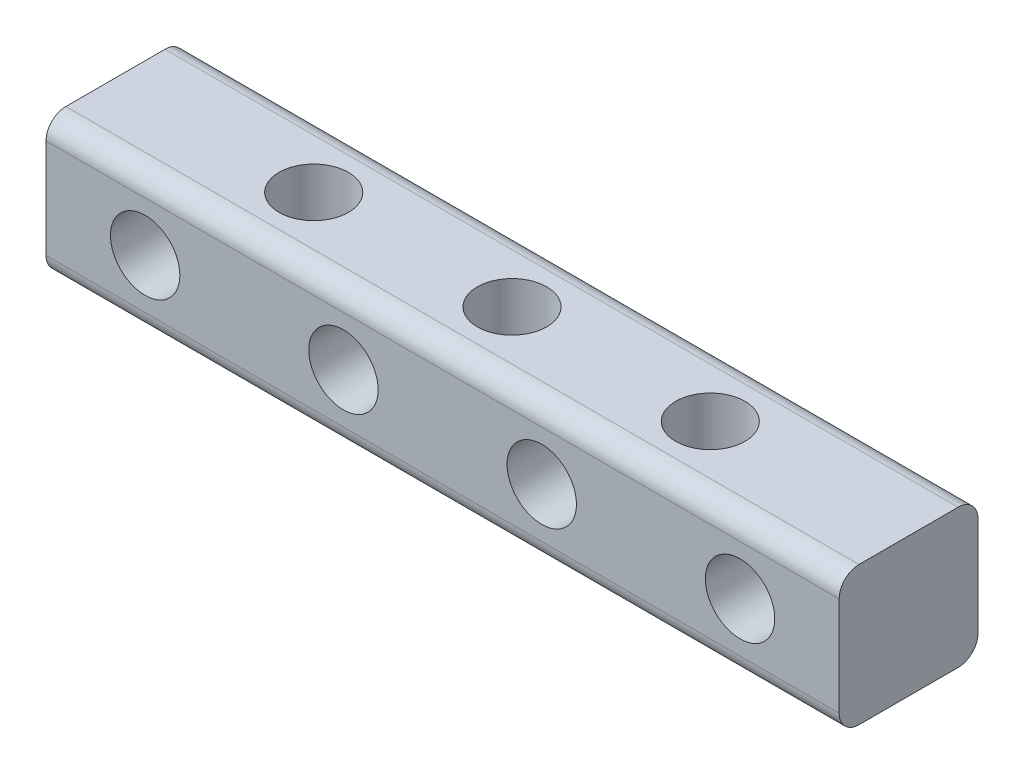
ISO-10303-21;
HEADER;
FILE_DESCRIPTION(('STEP AP214'),'2;1');
FILE_NAME('part.step','',(''),(''),'','','');
FILE_SCHEMA(('AUTOMOTIVE_DESIGN { 1 0 10303 214 1 1 1 1 }'));
ENDSEC;
DATA;
#1=APPLICATION_CONTEXT('core data for automotive mechanical design processes');
#2=APPLICATION_PROTOCOL_DEFINITION('international standard','automotive_design',2000,#1);
#3=PRODUCT_CONTEXT('',#1,'mechanical');
#4=PRODUCT('Part','Part','',(#3));
#5=PRODUCT_RELATED_PRODUCT_CATEGORY('part','',(#4));
#6=PRODUCT_DEFINITION_FORMATION('','',#4);
#7=PRODUCT_DEFINITION_CONTEXT('part definition',#1,'design');
#8=PRODUCT_DEFINITION('design','',#6,#7);
#9=PRODUCT_DEFINITION_SHAPE('','',#8);
#10=(LENGTH_UNIT() NAMED_UNIT(*) SI_UNIT(.MILLI.,.METRE.));
#11=(NAMED_UNIT(*) PLANE_ANGLE_UNIT() SI_UNIT($,.RADIAN.));
#12=(NAMED_UNIT(*) SI_UNIT($,.STERADIAN.) SOLID_ANGLE_UNIT());
#13=UNCERTAINTY_MEASURE_WITH_UNIT(LENGTH_MEASURE(1.E-05),#10,'distance_accuracy_value','');
#14=(GEOMETRIC_REPRESENTATION_CONTEXT(3) GLOBAL_UNCERTAINTY_ASSIGNED_CONTEXT((#13)) GLOBAL_UNIT_ASSIGNED_CONTEXT((#10,
#11,#12)) REPRESENTATION_CONTEXT('',''));
#15=CARTESIAN_POINT('',(0.,0.,0.));
#16=DIRECTION('',(0.,0.,1.));
#17=DIRECTION('',(1.,0.,0.));
#18=AXIS2_PLACEMENT_3D('',#15,#16,#17);
#19=CARTESIAN_POINT('',(0.,0.,7.));
#20=DIRECTION('',(0.,0.,-1.));
#21=DIRECTION('',(-1.,0.,0.));
#22=AXIS2_PLACEMENT_3D('',#19,#20,#21);
#23=PLANE('',#22);
#24=DIRECTION('',(0.,-1.,0.));
#25=VECTOR('',#24,1.);
#26=CARTESIAN_POINT('',(0.,0.,7.));
#27=LINE('',#26,#25);
#28=CARTESIAN_POINT('',(0.,6.,7.));
#29=VERTEX_POINT('',#28);
#30=CARTESIAN_POINT('',(0.,1.,7.));
#31=VERTEX_POINT('',#30);
#32=EDGE_CURVE('E192',#29,#31,#27,.T.);
#33=ORIENTED_EDGE('',*,*,#32,.T.);
#34=DIRECTION('',(1.,0.,0.));
#35=VECTOR('',#34,1.);
#36=CARTESIAN_POINT('',(0.,1.,7.));
#37=LINE('',#36,#35);
#38=CARTESIAN_POINT('',(40.,1.,7.));
#39=VERTEX_POINT('',#38);
#40=EDGE_CURVE('E173',#31,#39,#37,.T.);
#41=ORIENTED_EDGE('',*,*,#40,.T.);
#42=DIRECTION('',(0.,1.,0.));
#43=VECTOR('',#42,1.);
#44=CARTESIAN_POINT('',(40.,0.,7.));
#45=LINE('',#44,#43);
#46=CARTESIAN_POINT('',(40.,6.,7.));
#47=VERTEX_POINT('',#46);
#48=EDGE_CURVE('E116',#39,#47,#45,.T.);
#49=ORIENTED_EDGE('',*,*,#48,.T.);
#50=DIRECTION('',(-1.,0.,0.));
#51=VECTOR('',#50,1.);
#52=CARTESIAN_POINT('',(0.,6.,7.));
#53=LINE('',#52,#51);
#54=EDGE_CURVE('E169',#47,#29,#53,.T.);
#55=ORIENTED_EDGE('',*,*,#54,.T.);
#56=EDGE_LOOP('',(#33,#41,#49,#55));
#57=FACE_BOUND('',#56,.T.);
#58=CARTESIAN_POINT('',(5.,3.5,7.));
#59=DIRECTION('',(0.,0.,1.));
#60=DIRECTION('',(1.,0.,0.));
#61=AXIS2_PLACEMENT_3D('',#58,#59,#60);
#62=CIRCLE('',#61,1.75);
#63=CARTESIAN_POINT('',(6.75,3.5,7.));
#64=VERTEX_POINT('',#63);
#65=EDGE_CURVE('E208',#64,#64,#62,.T.);
#66=ORIENTED_EDGE('',*,*,#65,.F.);
#67=EDGE_LOOP('',(#66));
#68=FACE_BOUND('',#67,.T.);
#69=CARTESIAN_POINT('',(15.,3.5,7.));
#70=DIRECTION('',(0.,0.,1.));
#71=DIRECTION('',(1.,0.,0.));
#72=AXIS2_PLACEMENT_3D('',#69,#70,#71);
#73=CIRCLE('',#72,1.75);
#74=CARTESIAN_POINT('',(16.75,3.5,7.));
#75=VERTEX_POINT('',#74);
#76=EDGE_CURVE('E285',#75,#75,#73,.T.);
#77=ORIENTED_EDGE('',*,*,#76,.F.);
#78=EDGE_LOOP('',(#77));
#79=FACE_BOUND('',#78,.T.);
#80=CARTESIAN_POINT('',(25.,3.5,7.));
#81=DIRECTION('',(0.,0.,1.));
#82=DIRECTION('',(1.,0.,0.));
#83=AXIS2_PLACEMENT_3D('',#80,#81,#82);
#84=CIRCLE('',#83,1.75);
#85=CARTESIAN_POINT('',(26.75,3.5,7.));
#86=VERTEX_POINT('',#85);
#87=EDGE_CURVE('E290',#86,#86,#84,.T.);
#88=ORIENTED_EDGE('',*,*,#87,.F.);
#89=EDGE_LOOP('',(#88));
#90=FACE_BOUND('',#89,.T.);
#91=CARTESIAN_POINT('',(35.,3.5,7.));
#92=DIRECTION('',(0.,0.,1.));
#93=DIRECTION('',(1.,0.,0.));
#94=AXIS2_PLACEMENT_3D('',#91,#92,#93);
#95=CIRCLE('',#94,1.75);
#96=CARTESIAN_POINT('',(36.75,3.5,7.));
#97=VERTEX_POINT('',#96);
#98=EDGE_CURVE('E313',#97,#97,#95,.T.);
#99=ORIENTED_EDGE('',*,*,#98,.F.);
#100=EDGE_LOOP('',(#99));
#101=FACE_BOUND('',#100,.T.);
#102=ADVANCED_FACE('F44',(#57,#68,#79,#90,#101),#23,.F.);
#103=CARTESIAN_POINT('',(0.,0.,0.));
#104=DIRECTION('',(0.,0.,-1.));
#105=DIRECTION('',(-1.,0.,0.));
#106=AXIS2_PLACEMENT_3D('',#103,#104,#105);
#107=PLANE('',#106);
#108=CARTESIAN_POINT('',(25.,3.5,0.));
#109=DIRECTION('',(0.,0.,1.));
#110=DIRECTION('',(1.,0.,0.));
#111=AXIS2_PLACEMENT_3D('',#108,#109,#110);
#112=CIRCLE('',#111,1.75);
#113=CARTESIAN_POINT('',(26.75,3.5,0.));
#114=VERTEX_POINT('',#113);
#115=EDGE_CURVE('E296',#114,#114,#112,.T.);
#116=ORIENTED_EDGE('',*,*,#115,.T.);
#117=EDGE_LOOP('',(#116));
#118=FACE_BOUND('',#117,.T.);
#119=CARTESIAN_POINT('',(5.,3.5,0.));
#120=DIRECTION('',(0.,0.,1.));
#121=DIRECTION('',(1.,0.,0.));
#122=AXIS2_PLACEMENT_3D('',#119,#120,#121);
#123=CIRCLE('',#122,1.75);
#124=CARTESIAN_POINT('',(6.75,3.5,0.));
#125=VERTEX_POINT('',#124);
#126=EDGE_CURVE('E204',#125,#125,#123,.T.);
#127=ORIENTED_EDGE('',*,*,#126,.T.);
#128=EDGE_LOOP('',(#127));
#129=FACE_BOUND('',#128,.T.);
#130=DIRECTION('',(0.,1.,0.));
#131=VECTOR('',#130,1.);
#132=CARTESIAN_POINT('',(40.,0.,0.));
#133=LINE('',#132,#131);
#134=CARTESIAN_POINT('',(40.,1.,0.));
#135=VERTEX_POINT('',#134);
#136=CARTESIAN_POINT('',(40.,6.,0.));
#137=VERTEX_POINT('',#136);
#138=EDGE_CURVE('E196',#135,#137,#133,.T.);
#139=ORIENTED_EDGE('',*,*,#138,.F.);
#140=DIRECTION('',(1.,0.,0.));
#141=VECTOR('',#140,1.);
#142=CARTESIAN_POINT('',(0.,1.,0.));
#143=LINE('',#142,#141);
#144=CARTESIAN_POINT('',(0.,1.,0.));
#145=VERTEX_POINT('',#144);
#146=EDGE_CURVE('E157',#135,#145,#143,.F.);
#147=ORIENTED_EDGE('',*,*,#146,.T.);
#148=DIRECTION('',(0.,-1.,0.));
#149=VECTOR('',#148,1.);
#150=CARTESIAN_POINT('',(0.,0.,0.));
#151=LINE('',#150,#149);
#152=CARTESIAN_POINT('',(0.,6.,0.));
#153=VERTEX_POINT('',#152);
#154=EDGE_CURVE('E201',#153,#145,#151,.T.);
#155=ORIENTED_EDGE('',*,*,#154,.F.);
#156=DIRECTION('',(-1.,0.,0.));
#157=VECTOR('',#156,1.);
#158=CARTESIAN_POINT('',(40.,6.,0.));
#159=LINE('',#158,#157);
#160=EDGE_CURVE('E154',#153,#137,#159,.F.);
#161=ORIENTED_EDGE('',*,*,#160,.T.);
#162=EDGE_LOOP('',(#139,#147,#155,#161));
#163=FACE_BOUND('',#162,.T.);
#164=CARTESIAN_POINT('',(15.,3.5,0.));
#165=DIRECTION('',(0.,0.,1.));
#166=DIRECTION('',(1.,0.,0.));
#167=AXIS2_PLACEMENT_3D('',#164,#165,#166);
#168=CIRCLE('',#167,1.75);
#169=CARTESIAN_POINT('',(16.75,3.5,0.));
#170=VERTEX_POINT('',#169);
#171=EDGE_CURVE('E288',#170,#170,#168,.T.);
#172=ORIENTED_EDGE('',*,*,#171,.T.);
#173=EDGE_LOOP('',(#172));
#174=FACE_BOUND('',#173,.T.);
#175=CARTESIAN_POINT('',(35.,3.5,0.));
#176=DIRECTION('',(0.,0.,1.));
#177=DIRECTION('',(1.,0.,0.));
#178=AXIS2_PLACEMENT_3D('',#175,#176,#177);
#179=CIRCLE('',#178,1.75);
#180=CARTESIAN_POINT('',(36.75,3.5,0.));
#181=VERTEX_POINT('',#180);
#182=EDGE_CURVE('E315',#181,#181,#179,.T.);
#183=ORIENTED_EDGE('',*,*,#182,.T.);
#184=EDGE_LOOP('',(#183));
#185=FACE_BOUND('',#184,.T.);
#186=ADVANCED_FACE('F215',(#118,#129,#163,#174,#185),#107,.T.);
#187=CARTESIAN_POINT('',(0.,0.,7.));
#188=DIRECTION('',(1.,0.,0.));
#189=DIRECTION('',(0.,0.,-1.));
#190=AXIS2_PLACEMENT_3D('',#187,#188,#189);
#191=PLANE('',#190);
#192=ORIENTED_EDGE('',*,*,#154,.T.);
#193=CARTESIAN_POINT('',(0.,1.,1.));
#194=DIRECTION('',(1.,0.,0.));
#195=DIRECTION('',(0.,0.,-1.));
#196=AXIS2_PLACEMENT_3D('',#193,#194,#195);
#197=CIRCLE('',#196,1.);
#198=CARTESIAN_POINT('',(0.,0.,1.));
#199=VERTEX_POINT('',#198);
#200=EDGE_CURVE('E166',#145,#199,#197,.F.);
#201=ORIENTED_EDGE('',*,*,#200,.T.);
#202=DIRECTION('',(0.,0.,-1.));
#203=VECTOR('',#202,1.);
#204=CARTESIAN_POINT('',(0.,0.,7.));
#205=LINE('',#204,#203);
#206=CARTESIAN_POINT('',(0.,0.,6.));
#207=VERTEX_POINT('',#206);
#208=EDGE_CURVE('E134',#207,#199,#205,.T.);
#209=ORIENTED_EDGE('',*,*,#208,.F.);
#210=CARTESIAN_POINT('',(0.,1.,6.));
#211=DIRECTION('',(1.,0.,0.));
#212=DIRECTION('',(0.,0.,-1.));
#213=AXIS2_PLACEMENT_3D('',#210,#211,#212);
#214=CIRCLE('',#213,1.);
#215=EDGE_CURVE('E139',#207,#31,#214,.F.);
#216=ORIENTED_EDGE('',*,*,#215,.T.);
#217=ORIENTED_EDGE('',*,*,#32,.F.);
#218=CARTESIAN_POINT('',(0.,6.,6.));
#219=DIRECTION('',(1.,0.,0.));
#220=DIRECTION('',(0.,0.,-1.));
#221=AXIS2_PLACEMENT_3D('',#218,#219,#220);
#222=CIRCLE('',#221,1.);
#223=CARTESIAN_POINT('',(0.,7.,6.));
#224=VERTEX_POINT('',#223);
#225=EDGE_CURVE('E67',#29,#224,#222,.F.);
#226=ORIENTED_EDGE('',*,*,#225,.T.);
#227=DIRECTION('',(0.,0.,-1.));
#228=VECTOR('',#227,1.);
#229=CARTESIAN_POINT('',(0.,7.,7.));
#230=LINE('',#229,#228);
#231=CARTESIAN_POINT('',(0.,7.,1.));
#232=VERTEX_POINT('',#231);
#233=EDGE_CURVE('E181',#224,#232,#230,.T.);
#234=ORIENTED_EDGE('',*,*,#233,.T.);
#235=CARTESIAN_POINT('',(0.,6.,1.));
#236=DIRECTION('',(1.,0.,0.));
#237=DIRECTION('',(0.,0.,-1.));
#238=AXIS2_PLACEMENT_3D('',#235,#236,#237);
#239=CIRCLE('',#238,1.);
#240=EDGE_CURVE('E60',#232,#153,#239,.F.);
#241=ORIENTED_EDGE('',*,*,#240,.T.);
#242=EDGE_LOOP('',(#192,#201,#209,#216,#217,#226,#234,#241));
#243=FACE_BOUND('',#242,.T.);
#244=ADVANCED_FACE('F194',(#243),#191,.F.);
#245=CARTESIAN_POINT('',(0.,0.,7.));
#246=DIRECTION('',(0.,1.,0.));
#247=DIRECTION('',(0.,0.,1.));
#248=AXIS2_PLACEMENT_3D('',#245,#246,#247);
#249=PLANE('',#248);
#250=CARTESIAN_POINT('',(10.,0.,3.5));
#251=DIRECTION('',(0.,1.,0.));
#252=DIRECTION('',(0.,0.,1.));
#253=AXIS2_PLACEMENT_3D('',#250,#251,#252);
#254=CIRCLE('',#253,1.75);
#255=CARTESIAN_POINT('',(10.,0.,5.25));
#256=VERTEX_POINT('',#255);
#257=EDGE_CURVE('E332',#256,#256,#254,.T.);
#258=ORIENTED_EDGE('',*,*,#257,.T.);
#259=EDGE_LOOP('',(#258));
#260=FACE_BOUND('',#259,.T.);
#261=CARTESIAN_POINT('',(30.,0.,3.5));
#262=DIRECTION('',(0.,1.,0.));
#263=DIRECTION('',(0.,0.,1.));
#264=AXIS2_PLACEMENT_3D('',#261,#262,#263);
#265=CIRCLE('',#264,1.75);
#266=CARTESIAN_POINT('',(30.,0.,5.25));
#267=VERTEX_POINT('',#266);
#268=EDGE_CURVE('E340',#267,#267,#265,.T.);
#269=ORIENTED_EDGE('',*,*,#268,.T.);
#270=EDGE_LOOP('',(#269));
#271=FACE_BOUND('',#270,.T.);
#272=CARTESIAN_POINT('',(20.,0.,3.5));
#273=DIRECTION('',(0.,1.,0.));
#274=DIRECTION('',(0.,0.,1.));
#275=AXIS2_PLACEMENT_3D('',#272,#273,#274);
#276=CIRCLE('',#275,1.75);
#277=CARTESIAN_POINT('',(20.,0.,5.25));
#278=VERTEX_POINT('',#277);
#279=EDGE_CURVE('E321',#278,#278,#276,.T.);
#280=ORIENTED_EDGE('',*,*,#279,.T.);
#281=EDGE_LOOP('',(#280));
#282=FACE_BOUND('',#281,.T.);
#283=ORIENTED_EDGE('',*,*,#208,.T.);
#284=DIRECTION('',(1.,0.,0.));
#285=VECTOR('',#284,1.);
#286=CARTESIAN_POINT('',(40.,0.,1.));
#287=LINE('',#286,#285);
#288=CARTESIAN_POINT('',(40.,0.,1.));
#289=VERTEX_POINT('',#288);
#290=EDGE_CURVE('E132',#199,#289,#287,.T.);
#291=ORIENTED_EDGE('',*,*,#290,.T.);
#292=DIRECTION('',(0.,0.,-1.));
#293=VECTOR('',#292,1.);
#294=CARTESIAN_POINT('',(40.,0.,7.));
#295=LINE('',#294,#293);
#296=CARTESIAN_POINT('',(40.,0.,6.));
#297=VERTEX_POINT('',#296);
#298=EDGE_CURVE('E114',#297,#289,#295,.T.);
#299=ORIENTED_EDGE('',*,*,#298,.F.);
#300=DIRECTION('',(1.,0.,0.));
#301=VECTOR('',#300,1.);
#302=CARTESIAN_POINT('',(0.,0.,6.));
#303=LINE('',#302,#301);
#304=EDGE_CURVE('E129',#297,#207,#303,.F.);
#305=ORIENTED_EDGE('',*,*,#304,.T.);
#306=EDGE_LOOP('',(#283,#291,#299,#305));
#307=FACE_BOUND('',#306,.T.);
#308=ADVANCED_FACE('F128',(#260,#271,#282,#307),#249,.F.);
#309=CARTESIAN_POINT('',(40.,0.,7.));
#310=DIRECTION('',(-1.,0.,0.));
#311=DIRECTION('',(0.,0.,1.));
#312=AXIS2_PLACEMENT_3D('',#309,#310,#311);
#313=PLANE('',#312);
#314=ORIENTED_EDGE('',*,*,#298,.T.);
#315=CARTESIAN_POINT('',(40.,1.,1.));
#316=DIRECTION('',(-1.,0.,0.));
#317=DIRECTION('',(0.,0.,1.));
#318=AXIS2_PLACEMENT_3D('',#315,#316,#317);
#319=CIRCLE('',#318,1.);
#320=EDGE_CURVE('E122',#289,#135,#319,.F.);
#321=ORIENTED_EDGE('',*,*,#320,.T.);
#322=ORIENTED_EDGE('',*,*,#138,.T.);
#323=CARTESIAN_POINT('',(40.,6.,1.));
#324=DIRECTION('',(-1.,0.,0.));
#325=DIRECTION('',(0.,0.,1.));
#326=AXIS2_PLACEMENT_3D('',#323,#324,#325);
#327=CIRCLE('',#326,1.);
#328=CARTESIAN_POINT('',(40.,7.,1.));
#329=VERTEX_POINT('',#328);
#330=EDGE_CURVE('E123',#137,#329,#327,.F.);
#331=ORIENTED_EDGE('',*,*,#330,.T.);
#332=DIRECTION('',(0.,0.,-1.));
#333=VECTOR('',#332,1.);
#334=CARTESIAN_POINT('',(40.,7.,7.));
#335=LINE('',#334,#333);
#336=CARTESIAN_POINT('',(40.,7.,6.));
#337=VERTEX_POINT('',#336);
#338=EDGE_CURVE('E135',#337,#329,#335,.T.);
#339=ORIENTED_EDGE('',*,*,#338,.F.);
#340=CARTESIAN_POINT('',(40.,6.,6.));
#341=DIRECTION('',(-1.,0.,0.));
#342=DIRECTION('',(0.,0.,1.));
#343=AXIS2_PLACEMENT_3D('',#340,#341,#342);
#344=CIRCLE('',#343,1.);
#345=EDGE_CURVE('E144',#337,#47,#344,.F.);
#346=ORIENTED_EDGE('',*,*,#345,.T.);
#347=ORIENTED_EDGE('',*,*,#48,.F.);
#348=CARTESIAN_POINT('',(40.,1.,6.));
#349=DIRECTION('',(-1.,0.,0.));
#350=DIRECTION('',(0.,0.,1.));
#351=AXIS2_PLACEMENT_3D('',#348,#349,#350);
#352=CIRCLE('',#351,1.);
#353=EDGE_CURVE('E111',#39,#297,#352,.F.);
#354=ORIENTED_EDGE('',*,*,#353,.T.);
#355=EDGE_LOOP('',(#314,#321,#322,#331,#339,#346,#347,#354));
#356=FACE_BOUND('',#355,.T.);
#357=ADVANCED_FACE('F113',(#356),#313,.F.);
#358=CARTESIAN_POINT('',(0.,7.,7.));
#359=DIRECTION('',(0.,-1.,0.));
#360=DIRECTION('',(0.,0.,-1.));
#361=AXIS2_PLACEMENT_3D('',#358,#359,#360);
#362=PLANE('',#361);
#363=CARTESIAN_POINT('',(10.,7.,3.5));
#364=DIRECTION('',(0.,1.,0.));
#365=DIRECTION('',(0.,0.,1.));
#366=AXIS2_PLACEMENT_3D('',#363,#364,#365);
#367=CIRCLE('',#366,1.75);
#368=CARTESIAN_POINT('',(10.,7.,5.25));
#369=VERTEX_POINT('',#368);
#370=EDGE_CURVE('E336',#369,#369,#367,.T.);
#371=ORIENTED_EDGE('',*,*,#370,.F.);
#372=EDGE_LOOP('',(#371));
#373=FACE_BOUND('',#372,.T.);
#374=CARTESIAN_POINT('',(30.,7.,3.5));
#375=DIRECTION('',(0.,1.,0.));
#376=DIRECTION('',(0.,0.,1.));
#377=AXIS2_PLACEMENT_3D('',#374,#375,#376);
#378=CIRCLE('',#377,1.75);
#379=CARTESIAN_POINT('',(30.,7.,5.25));
#380=VERTEX_POINT('',#379);
#381=EDGE_CURVE('E328',#380,#380,#378,.T.);
#382=ORIENTED_EDGE('',*,*,#381,.F.);
#383=EDGE_LOOP('',(#382));
#384=FACE_BOUND('',#383,.T.);
#385=CARTESIAN_POINT('',(20.,7.,3.5));
#386=DIRECTION('',(0.,1.,0.));
#387=DIRECTION('',(0.,0.,1.));
#388=AXIS2_PLACEMENT_3D('',#385,#386,#387);
#389=CIRCLE('',#388,1.75);
#390=CARTESIAN_POINT('',(20.,7.,5.25));
#391=VERTEX_POINT('',#390);
#392=EDGE_CURVE('E324',#391,#391,#389,.T.);
#393=ORIENTED_EDGE('',*,*,#392,.F.);
#394=EDGE_LOOP('',(#393));
#395=FACE_BOUND('',#394,.T.);
#396=ORIENTED_EDGE('',*,*,#338,.T.);
#397=DIRECTION('',(-1.,0.,0.));
#398=VECTOR('',#397,1.);
#399=CARTESIAN_POINT('',(0.,7.,1.));
#400=LINE('',#399,#398);
#401=EDGE_CURVE('E11',#329,#232,#400,.T.);
#402=ORIENTED_EDGE('',*,*,#401,.T.);
#403=ORIENTED_EDGE('',*,*,#233,.F.);
#404=DIRECTION('',(-1.,0.,0.));
#405=VECTOR('',#404,1.);
#406=CARTESIAN_POINT('',(0.,7.,6.));
#407=LINE('',#406,#405);
#408=EDGE_CURVE('E53',#224,#337,#407,.F.);
#409=ORIENTED_EDGE('',*,*,#408,.T.);
#410=EDGE_LOOP('',(#396,#402,#403,#409));
#411=FACE_BOUND('',#410,.T.);
#412=ADVANCED_FACE('F180',(#373,#384,#395,#411),#362,.F.);
#413=CARTESIAN_POINT('',(5.,3.5,7.));
#414=DIRECTION('',(0.,0.,-1.));
#415=DIRECTION('',(-1.,0.,0.));
#416=AXIS2_PLACEMENT_3D('',#413,#414,#415);
#417=CYLINDRICAL_SURFACE('',#416,1.75);
#418=ORIENTED_EDGE('',*,*,#65,.T.);
#419=EDGE_LOOP('',(#418));
#420=FACE_BOUND('',#419,.T.);
#421=ORIENTED_EDGE('',*,*,#126,.F.);
#422=EDGE_LOOP('',(#421));
#423=FACE_BOUND('',#422,.T.);
#424=ADVANCED_FACE('F235',(#420,#423),#417,.F.);
#425=CARTESIAN_POINT('',(15.,3.5,7.));
#426=DIRECTION('',(0.,0.,-1.));
#427=DIRECTION('',(-1.,0.,0.));
#428=AXIS2_PLACEMENT_3D('',#425,#426,#427);
#429=CYLINDRICAL_SURFACE('',#428,1.75);
#430=ORIENTED_EDGE('',*,*,#76,.T.);
#431=EDGE_LOOP('',(#430));
#432=FACE_BOUND('',#431,.T.);
#433=ORIENTED_EDGE('',*,*,#171,.F.);
#434=EDGE_LOOP('',(#433));
#435=FACE_BOUND('',#434,.T.);
#436=ADVANCED_FACE('F274',(#432,#435),#429,.F.);
#437=CARTESIAN_POINT('',(25.,3.5,7.));
#438=DIRECTION('',(0.,0.,-1.));
#439=DIRECTION('',(-1.,0.,0.));
#440=AXIS2_PLACEMENT_3D('',#437,#438,#439);
#441=CYLINDRICAL_SURFACE('',#440,1.75);
#442=ORIENTED_EDGE('',*,*,#87,.T.);
#443=EDGE_LOOP('',(#442));
#444=FACE_BOUND('',#443,.T.);
#445=ORIENTED_EDGE('',*,*,#115,.F.);
#446=EDGE_LOOP('',(#445));
#447=FACE_BOUND('',#446,.T.);
#448=ADVANCED_FACE('F271',(#444,#447),#441,.F.);
#449=CARTESIAN_POINT('',(35.,3.5,7.));
#450=DIRECTION('',(0.,0.,-1.));
#451=DIRECTION('',(-1.,0.,0.));
#452=AXIS2_PLACEMENT_3D('',#449,#450,#451);
#453=CYLINDRICAL_SURFACE('',#452,1.75);
#454=ORIENTED_EDGE('',*,*,#98,.T.);
#455=EDGE_LOOP('',(#454));
#456=FACE_BOUND('',#455,.T.);
#457=ORIENTED_EDGE('',*,*,#182,.F.);
#458=EDGE_LOOP('',(#457));
#459=FACE_BOUND('',#458,.T.);
#460=ADVANCED_FACE('F267',(#456,#459),#453,.F.);
#461=CARTESIAN_POINT('',(20.,0.,3.5));
#462=DIRECTION('',(0.,1.,0.));
#463=DIRECTION('',(0.,0.,1.));
#464=AXIS2_PLACEMENT_3D('',#461,#462,#463);
#465=CYLINDRICAL_SURFACE('',#464,1.75);
#466=ORIENTED_EDGE('',*,*,#279,.F.);
#467=EDGE_LOOP('',(#466));
#468=FACE_BOUND('',#467,.T.);
#469=ORIENTED_EDGE('',*,*,#392,.T.);
#470=EDGE_LOOP('',(#469));
#471=FACE_BOUND('',#470,.T.);
#472=ADVANCED_FACE('F259',(#468,#471),#465,.F.);
#473=CARTESIAN_POINT('',(30.,0.,3.5));
#474=DIRECTION('',(0.,1.,0.));
#475=DIRECTION('',(0.,0.,1.));
#476=AXIS2_PLACEMENT_3D('',#473,#474,#475);
#477=CYLINDRICAL_SURFACE('',#476,1.75);
#478=ORIENTED_EDGE('',*,*,#268,.F.);
#479=EDGE_LOOP('',(#478));
#480=FACE_BOUND('',#479,.T.);
#481=ORIENTED_EDGE('',*,*,#381,.T.);
#482=EDGE_LOOP('',(#481));
#483=FACE_BOUND('',#482,.T.);
#484=ADVANCED_FACE('F253',(#480,#483),#477,.F.);
#485=CARTESIAN_POINT('',(10.,0.,3.5));
#486=DIRECTION('',(0.,1.,0.));
#487=DIRECTION('',(0.,0.,1.));
#488=AXIS2_PLACEMENT_3D('',#485,#486,#487);
#489=CYLINDRICAL_SURFACE('',#488,1.75);
#490=ORIENTED_EDGE('',*,*,#257,.F.);
#491=EDGE_LOOP('',(#490));
#492=FACE_BOUND('',#491,.T.);
#493=ORIENTED_EDGE('',*,*,#370,.T.);
#494=EDGE_LOOP('',(#493));
#495=FACE_BOUND('',#494,.T.);
#496=ADVANCED_FACE('F249',(#492,#495),#489,.F.);
#497=CARTESIAN_POINT('',(0.,1.,1.));
#498=DIRECTION('',(-1.,0.,0.));
#499=DIRECTION('',(0.,0.,1.));
#500=AXIS2_PLACEMENT_3D('',#497,#498,#499);
#501=CYLINDRICAL_SURFACE('',#500,1.);
#502=ORIENTED_EDGE('',*,*,#200,.F.);
#503=ORIENTED_EDGE('',*,*,#146,.F.);
#504=ORIENTED_EDGE('',*,*,#320,.F.);
#505=ORIENTED_EDGE('',*,*,#290,.F.);
#506=EDGE_LOOP('',(#502,#503,#504,#505));
#507=FACE_BOUND('',#506,.T.);
#508=ADVANCED_FACE('F224',(#507),#501,.T.);
#509=CARTESIAN_POINT('',(0.,1.,6.));
#510=DIRECTION('',(1.,0.,0.));
#511=DIRECTION('',(0.,0.,-1.));
#512=AXIS2_PLACEMENT_3D('',#509,#510,#511);
#513=CYLINDRICAL_SURFACE('',#512,1.);
#514=ORIENTED_EDGE('',*,*,#215,.F.);
#515=ORIENTED_EDGE('',*,*,#304,.F.);
#516=ORIENTED_EDGE('',*,*,#353,.F.);
#517=ORIENTED_EDGE('',*,*,#40,.F.);
#518=EDGE_LOOP('',(#514,#515,#516,#517));
#519=FACE_BOUND('',#518,.T.);
#520=ADVANCED_FACE('F138',(#519),#513,.T.);
#521=CARTESIAN_POINT('',(0.,6.,1.));
#522=DIRECTION('',(1.,0.,0.));
#523=DIRECTION('',(0.,0.,-1.));
#524=AXIS2_PLACEMENT_3D('',#521,#522,#523);
#525=CYLINDRICAL_SURFACE('',#524,1.);
#526=ORIENTED_EDGE('',*,*,#330,.F.);
#527=ORIENTED_EDGE('',*,*,#160,.F.);
#528=ORIENTED_EDGE('',*,*,#240,.F.);
#529=ORIENTED_EDGE('',*,*,#401,.F.);
#530=EDGE_LOOP('',(#526,#527,#528,#529));
#531=FACE_BOUND('',#530,.T.);
#532=ADVANCED_FACE('F218',(#531),#525,.T.);
#533=CARTESIAN_POINT('',(0.,6.,6.));
#534=DIRECTION('',(-1.,0.,0.));
#535=DIRECTION('',(0.,0.,1.));
#536=AXIS2_PLACEMENT_3D('',#533,#534,#535);
#537=CYLINDRICAL_SURFACE('',#536,1.);
#538=ORIENTED_EDGE('',*,*,#345,.F.);
#539=ORIENTED_EDGE('',*,*,#408,.F.);
#540=ORIENTED_EDGE('',*,*,#225,.F.);
#541=ORIENTED_EDGE('',*,*,#54,.F.);
#542=EDGE_LOOP('',(#538,#539,#540,#541));
#543=FACE_BOUND('',#542,.T.);
#544=ADVANCED_FACE('F46',(#543),#537,.T.);
#545=CLOSED_SHELL('',(#102,#186,#244,#308,#357,#412,#424,#436,#448,#460,#472,#484,#496,#508,
#520,#532,#544));
#546=MANIFOLD_SOLID_BREP('B2',#545);
#547=ADVANCED_BREP_SHAPE_REPRESENTATION('',(#18,#546),#14);
#548=SHAPE_DEFINITION_REPRESENTATION(#9,#547);
ENDSEC;
END-ISO-10303-21;
